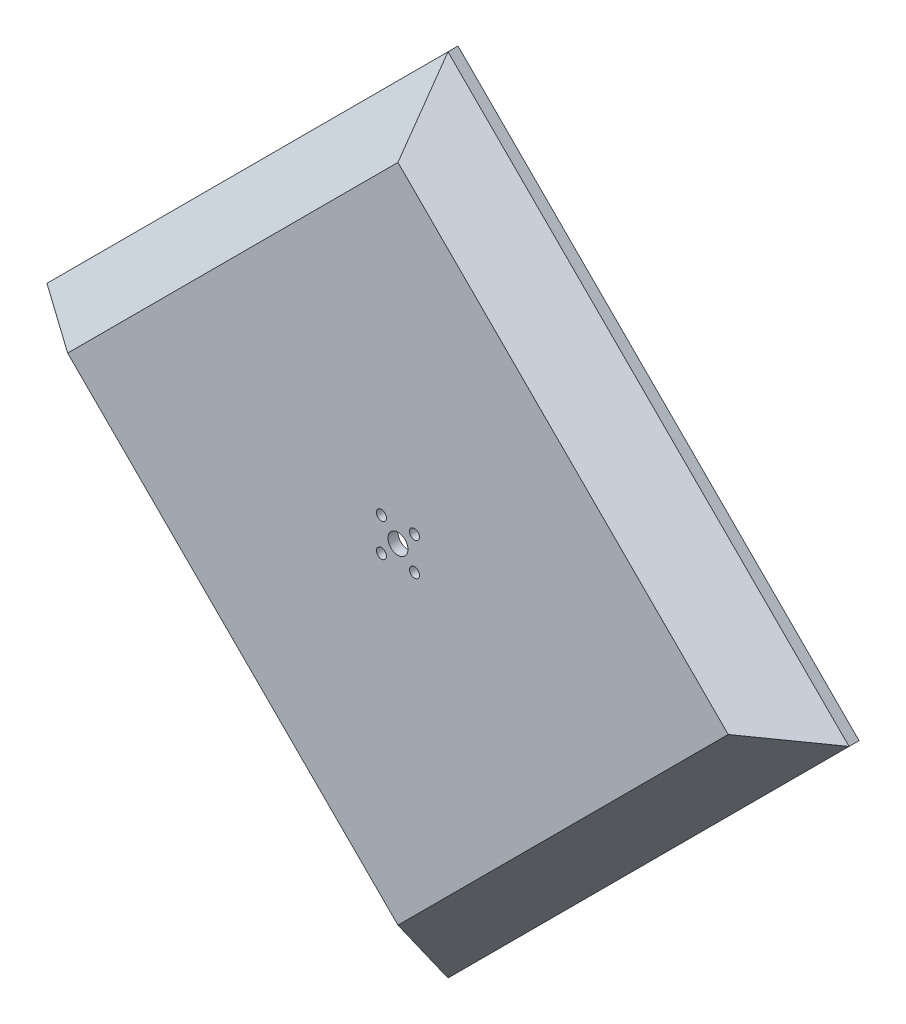
ISO-10303-21;
HEADER;
FILE_DESCRIPTION(('STEP AP214'),'2;1');
FILE_NAME('part.step','',(''),(''),'','','');
FILE_SCHEMA(('AUTOMOTIVE_DESIGN { 1 0 10303 214 1 1 1 1 }'));
ENDSEC;
DATA;
#1=APPLICATION_CONTEXT('core data for automotive mechanical design processes');
#2=APPLICATION_PROTOCOL_DEFINITION('international standard','automotive_design',2000,#1);
#3=PRODUCT_CONTEXT('',#1,'mechanical');
#4=PRODUCT('Part','Part','',(#3));
#5=PRODUCT_RELATED_PRODUCT_CATEGORY('part','',(#4));
#6=PRODUCT_DEFINITION_FORMATION('','',#4);
#7=PRODUCT_DEFINITION_CONTEXT('part definition',#1,'design');
#8=PRODUCT_DEFINITION('design','',#6,#7);
#9=PRODUCT_DEFINITION_SHAPE('','',#8);
#10=(LENGTH_UNIT() NAMED_UNIT(*) SI_UNIT(.MILLI.,.METRE.));
#11=(NAMED_UNIT(*) PLANE_ANGLE_UNIT() SI_UNIT($,.RADIAN.));
#12=(NAMED_UNIT(*) SI_UNIT($,.STERADIAN.) SOLID_ANGLE_UNIT());
#13=UNCERTAINTY_MEASURE_WITH_UNIT(LENGTH_MEASURE(1.E-05),#10,'distance_accuracy_value','');
#14=(GEOMETRIC_REPRESENTATION_CONTEXT(3) GLOBAL_UNCERTAINTY_ASSIGNED_CONTEXT((#13)) GLOBAL_UNIT_ASSIGNED_CONTEXT((#10,
#11,#12)) REPRESENTATION_CONTEXT('',''));
#15=CARTESIAN_POINT('',(0.,0.,0.));
#16=DIRECTION('',(0.,0.,1.));
#17=DIRECTION('',(1.,0.,0.));
#18=AXIS2_PLACEMENT_3D('',#15,#16,#17);
#19=CARTESIAN_POINT('',(0.,0.,0.));
#20=DIRECTION('',(0.,0.,1.));
#21=DIRECTION('',(1.,0.,0.));
#22=AXIS2_PLACEMENT_3D('',#19,#20,#21);
#23=PLANE('',#22);
#24=CARTESIAN_POINT('',(-4.95,-4.95,0.));
#25=DIRECTION('',(0.,0.,-1.));
#26=DIRECTION('',(-1.,0.,0.));
#27=AXIS2_PLACEMENT_3D('',#24,#25,#26);
#28=CIRCLE('',#27,1.5);
#29=CARTESIAN_POINT('',(-6.45,-4.95,0.));
#30=VERTEX_POINT('',#29);
#31=EDGE_CURVE('E229',#30,#30,#28,.T.);
#32=ORIENTED_EDGE('',*,*,#31,.F.);
#33=EDGE_LOOP('',(#32));
#34=FACE_BOUND('',#33,.T.);
#35=CARTESIAN_POINT('',(4.95,-4.95,0.));
#36=DIRECTION('',(0.,0.,-1.));
#37=DIRECTION('',(-1.,0.,0.));
#38=AXIS2_PLACEMENT_3D('',#35,#36,#37);
#39=CIRCLE('',#38,1.5);
#40=CARTESIAN_POINT('',(3.45,-4.95,0.));
#41=VERTEX_POINT('',#40);
#42=EDGE_CURVE('E221',#41,#41,#39,.T.);
#43=ORIENTED_EDGE('',*,*,#42,.F.);
#44=EDGE_LOOP('',(#43));
#45=FACE_BOUND('',#44,.T.);
#46=CARTESIAN_POINT('',(4.95,4.95,0.));
#47=DIRECTION('',(0.,0.,-1.));
#48=DIRECTION('',(-1.,0.,0.));
#49=AXIS2_PLACEMENT_3D('',#46,#47,#48);
#50=CIRCLE('',#49,1.5);
#51=CARTESIAN_POINT('',(3.45,4.95,0.));
#52=VERTEX_POINT('',#51);
#53=EDGE_CURVE('E213',#52,#52,#50,.T.);
#54=ORIENTED_EDGE('',*,*,#53,.F.);
#55=EDGE_LOOP('',(#54));
#56=FACE_BOUND('',#55,.T.);
#57=CARTESIAN_POINT('',(-4.95,4.95,0.));
#58=DIRECTION('',(0.,0.,-1.));
#59=DIRECTION('',(-1.,0.,0.));
#60=AXIS2_PLACEMENT_3D('',#57,#58,#59);
#61=CIRCLE('',#60,1.5);
#62=CARTESIAN_POINT('',(-6.45,4.95,0.));
#63=VERTEX_POINT('',#62);
#64=EDGE_CURVE('E204',#63,#63,#61,.T.);
#65=ORIENTED_EDGE('',*,*,#64,.F.);
#66=EDGE_LOOP('',(#65));
#67=FACE_BOUND('',#66,.T.);
#68=CARTESIAN_POINT('',(0.,0.,0.));
#69=DIRECTION('',(0.,0.,-1.));
#70=DIRECTION('',(-1.,0.,0.));
#71=AXIS2_PLACEMENT_3D('',#68,#69,#70);
#72=CIRCLE('',#71,3.);
#73=CARTESIAN_POINT('',(-3.,0.,0.));
#74=VERTEX_POINT('',#73);
#75=EDGE_CURVE('E208',#74,#74,#72,.T.);
#76=ORIENTED_EDGE('',*,*,#75,.F.);
#77=EDGE_LOOP('',(#76));
#78=FACE_BOUND('',#77,.T.);
#79=DIRECTION('',(-0.707106781186544,0.707106781186551,0.));
#80=VECTOR('',#79,1.);
#81=CARTESIAN_POINT('',(109.601551083914,-10.6066017177989,0.));
#82=LINE('',#81,#80);
#83=CARTESIAN_POINT('',(98.9949493661164,-6.956241138667E-13,0.));
#84=VERTEX_POINT('',#83);
#85=CARTESIAN_POINT('',(1.06858966120171E-12,98.9949493661157,0.));
#86=VERTEX_POINT('',#85);
#87=EDGE_CURVE('E193',#84,#86,#82,.T.);
#88=ORIENTED_EDGE('',*,*,#87,.F.);
#89=DIRECTION('',(0.707106781186554,0.707106781186541,0.));
#90=VECTOR('',#89,1.);
#91=CARTESIAN_POINT('',(-10.6066017177993,-109.601551083914,0.));
#92=LINE('',#91,#90);
#93=CARTESIAN_POINT('',(-3.81639164714898E-13,-98.9949493661164,0.));
#94=VERTEX_POINT('',#93);
#95=EDGE_CURVE('E60',#94,#84,#92,.T.);
#96=ORIENTED_EDGE('',*,*,#95,.F.);
#97=DIRECTION('',(0.707106781186544,-0.707106781186551,0.));
#98=VECTOR('',#97,1.);
#99=CARTESIAN_POINT('',(-109.601551083914,10.6066017177989,0.));
#100=LINE('',#99,#98);
#101=CARTESIAN_POINT('',(-98.9949493661167,1.06858966120171E-12,0.));
#102=VERTEX_POINT('',#101);
#103=EDGE_CURVE('E65',#102,#94,#100,.T.);
#104=ORIENTED_EDGE('',*,*,#103,.F.);
#105=DIRECTION('',(-0.707106781186559,-0.707106781186536,0.));
#106=VECTOR('',#105,1.);
#107=CARTESIAN_POINT('',(10.6066017178001,109.601551083914,0.));
#108=LINE('',#107,#106);
#109=EDGE_CURVE('E154',#86,#102,#108,.T.);
#110=ORIENTED_EDGE('',*,*,#109,.F.);
#111=EDGE_LOOP('',(#88,#96,#104,#110));
#112=FACE_BOUND('',#111,.T.);
#113=ADVANCED_FACE('F45',(#34,#45,#56,#67,#78,#112),#23,.F.);
#114=CARTESIAN_POINT('',(84.8528137423853,-35.3553390593278,34.9999999999998));
#115=DIRECTION('',(-0.500000000000003,-0.499999999999997,-0.707106781186547));
#116=DIRECTION('',(-0.816496580927724,0.,0.577350269189628));
#117=AXIS2_PLACEMENT_3D('',#114,#115,#116);
#118=PLANE('',#117);
#119=DIRECTION('',(0.816496580927726,0.,-0.577350269189625));
#120=VECTOR('',#119,1.);
#121=CARTESIAN_POINT('',(73.0677007226098,-5.27355936696949E-13,18.3333333333332));
#122=LINE('',#121,#120);
#123=CARTESIAN_POINT('',(120.208152801713,-7.7715611723761E-13,-15.));
#124=VERTEX_POINT('',#123);
#125=EDGE_CURVE('E181',#84,#124,#122,.T.);
#126=ORIENTED_EDGE('',*,*,#125,.F.);
#127=ORIENTED_EDGE('',*,*,#87,.T.);
#128=DIRECTION('',(0.,-0.816496580927725,0.577350269189628));
#129=VECTOR('',#128,1.);
#130=CARTESIAN_POINT('',(0.,-7.07106781186514,74.9999999999995));
#131=LINE('',#130,#129);
#132=CARTESIAN_POINT('',(3.87989273946798E-13,120.208152801713,-15.));
#133=VERTEX_POINT('',#132);
#134=EDGE_CURVE('E170',#133,#86,#131,.T.);
#135=ORIENTED_EDGE('',*,*,#134,.F.);
#136=DIRECTION('',(-0.707106781186544,0.707106781186551,0.));
#137=VECTOR('',#136,1.);
#138=CARTESIAN_POINT('',(120.208152801713,-7.7715611723761E-13,-15.));
#139=LINE('',#138,#137);
#140=EDGE_CURVE('E198',#124,#133,#139,.T.);
#141=ORIENTED_EDGE('',*,*,#140,.F.);
#142=EDGE_LOOP('',(#126,#127,#135,#141));
#143=FACE_BOUND('',#142,.T.);
#144=ADVANCED_FACE('F245',(#143),#118,.T.);
#145=CARTESIAN_POINT('',(85.9134739141651,-34.2946788875481,36.4999999999998));
#146=DIRECTION('',(0.500000000000002,0.499999999999997,0.707106781186548));
#147=DIRECTION('',(0.816496580927725,0.,-0.577350269189628));
#148=AXIS2_PLACEMENT_3D('',#145,#146,#147);
#149=PLANE('',#148);
#150=DIRECTION('',(-0.707106781186544,0.707106781186551,0.));
#151=VECTOR('',#150,1.);
#152=CARTESIAN_POINT('',(120.208152801713,-7.7715611723761E-13,-12.));
#153=LINE('',#152,#151);
#154=CARTESIAN_POINT('',(120.208152801712,-1.72421657621854E-12,-12.));
#155=VERTEX_POINT('',#154);
#156=CARTESIAN_POINT('',(3.78213664091006E-13,120.208152801711,-12.));
#157=VERTEX_POINT('',#156);
#158=EDGE_CURVE('E190',#155,#157,#153,.T.);
#159=ORIENTED_EDGE('',*,*,#158,.T.);
#160=DIRECTION('',(0.,-0.816496580927715,0.577350269189642));
#161=VECTOR('',#160,1.);
#162=CARTESIAN_POINT('',(1.56819002228303E-12,74.4819142849816,20.3333333333342));
#163=LINE('',#162,#161);
#164=CARTESIAN_POINT('',(9.21841306992609E-13,98.9949493661155,3.));
#165=VERTEX_POINT('',#164);
#166=EDGE_CURVE('E11',#157,#165,#163,.T.);
#167=ORIENTED_EDGE('',*,*,#166,.T.);
#168=DIRECTION('',(0.707106781186544,-0.707106781186551,0.));
#169=VECTOR('',#168,1.);
#170=CARTESIAN_POINT('',(-16.9705627484769,115.965512114594,3.));
#171=LINE('',#170,#169);
#172=CARTESIAN_POINT('',(98.9949493661158,-2.96688599613991E-13,3.));
#173=VERTEX_POINT('',#172);
#174=EDGE_CURVE('E135',#165,#173,#171,.T.);
#175=ORIENTED_EDGE('',*,*,#174,.T.);
#176=DIRECTION('',(0.816496580927706,0.,-0.577350269189654));
#177=VECTOR('',#176,1.);
#178=CARTESIAN_POINT('',(35.8267435801212,-1.11022302462516E-13,47.6666666666674));
#179=LINE('',#178,#177);
#180=EDGE_CURVE('E264',#173,#155,#179,.T.);
#181=ORIENTED_EDGE('',*,*,#180,.T.);
#182=EDGE_LOOP('',(#159,#167,#175,#181));
#183=FACE_BOUND('',#182,.T.);
#184=ADVANCED_FACE('F286',(#183),#149,.T.);
#185=CARTESIAN_POINT('',(0.,0.,3.));
#186=DIRECTION('',(0.,0.,1.));
#187=DIRECTION('',(1.,0.,0.));
#188=AXIS2_PLACEMENT_3D('',#185,#186,#187);
#189=PLANE('',#188);
#190=ORIENTED_EDGE('',*,*,#174,.F.);
#191=DIRECTION('',(0.707106781186548,0.707106781186546,0.));
#192=VECTOR('',#191,1.);
#193=CARTESIAN_POINT('',(-115.965512114593,-16.9705627484773,3.));
#194=LINE('',#193,#192);
#195=CARTESIAN_POINT('',(-98.9949493661163,1.45633505255194E-12,3.00000000000001));
#196=VERTEX_POINT('',#195);
#197=EDGE_CURVE('E134',#196,#165,#194,.T.);
#198=ORIENTED_EDGE('',*,*,#197,.F.);
#199=DIRECTION('',(-0.707106781186539,0.707106781186556,0.));
#200=VECTOR('',#199,1.);
#201=CARTESIAN_POINT('',(16.9705627484761,-115.965512114594,3.));
#202=LINE('',#201,#200);
#203=CARTESIAN_POINT('',(-6.34029865646341E-13,-98.9949493661165,3.00000000000001));
#204=VERTEX_POINT('',#203);
#205=EDGE_CURVE('E129',#204,#196,#202,.T.);
#206=ORIENTED_EDGE('',*,*,#205,.F.);
#207=DIRECTION('',(-0.707106781186548,-0.707106781186546,0.));
#208=VECTOR('',#207,1.);
#209=CARTESIAN_POINT('',(115.965512114593,16.9705627484773,3.));
#210=LINE('',#209,#208);
#211=EDGE_CURVE('E267',#173,#204,#210,.T.);
#212=ORIENTED_EDGE('',*,*,#211,.F.);
#213=EDGE_LOOP('',(#190,#198,#206,#212));
#214=FACE_BOUND('',#213,.T.);
#215=CARTESIAN_POINT('',(-4.95,-4.95,3.));
#216=DIRECTION('',(0.,0.,-1.));
#217=DIRECTION('',(-1.,0.,0.));
#218=AXIS2_PLACEMENT_3D('',#215,#216,#217);
#219=CIRCLE('',#218,1.5);
#220=CARTESIAN_POINT('',(-6.45,-4.95,3.));
#221=VERTEX_POINT('',#220);
#222=EDGE_CURVE('E197',#221,#221,#219,.T.);
#223=ORIENTED_EDGE('',*,*,#222,.T.);
#224=EDGE_LOOP('',(#223));
#225=FACE_BOUND('',#224,.T.);
#226=CARTESIAN_POINT('',(4.95,-4.95,3.));
#227=DIRECTION('',(0.,0.,-1.));
#228=DIRECTION('',(-1.,0.,0.));
#229=AXIS2_PLACEMENT_3D('',#226,#227,#228);
#230=CIRCLE('',#229,1.5);
#231=CARTESIAN_POINT('',(3.45,-4.95,3.));
#232=VERTEX_POINT('',#231);
#233=EDGE_CURVE('E225',#232,#232,#230,.T.);
#234=ORIENTED_EDGE('',*,*,#233,.T.);
#235=EDGE_LOOP('',(#234));
#236=FACE_BOUND('',#235,.T.);
#237=CARTESIAN_POINT('',(4.95,4.95,3.));
#238=DIRECTION('',(0.,0.,-1.));
#239=DIRECTION('',(-1.,0.,0.));
#240=AXIS2_PLACEMENT_3D('',#237,#238,#239);
#241=CIRCLE('',#240,1.5);
#242=CARTESIAN_POINT('',(3.45,4.95,3.));
#243=VERTEX_POINT('',#242);
#244=EDGE_CURVE('E217',#243,#243,#241,.T.);
#245=ORIENTED_EDGE('',*,*,#244,.T.);
#246=EDGE_LOOP('',(#245));
#247=FACE_BOUND('',#246,.T.);
#248=CARTESIAN_POINT('',(-4.95,4.95,3.));
#249=DIRECTION('',(0.,0.,-1.));
#250=DIRECTION('',(-1.,0.,0.));
#251=AXIS2_PLACEMENT_3D('',#248,#249,#250);
#252=CIRCLE('',#251,1.5);
#253=CARTESIAN_POINT('',(-6.45,4.95,3.));
#254=VERTEX_POINT('',#253);
#255=EDGE_CURVE('E209',#254,#254,#252,.T.);
#256=ORIENTED_EDGE('',*,*,#255,.T.);
#257=EDGE_LOOP('',(#256));
#258=FACE_BOUND('',#257,.T.);
#259=CARTESIAN_POINT('',(0.,0.,3.));
#260=DIRECTION('',(0.,0.,-1.));
#261=DIRECTION('',(-1.,0.,0.));
#262=AXIS2_PLACEMENT_3D('',#259,#260,#261);
#263=CIRCLE('',#262,3.);
#264=CARTESIAN_POINT('',(-3.,0.,3.));
#265=VERTEX_POINT('',#264);
#266=EDGE_CURVE('E53',#265,#265,#263,.T.);
#267=ORIENTED_EDGE('',*,*,#266,.T.);
#268=EDGE_LOOP('',(#267));
#269=FACE_BOUND('',#268,.T.);
#270=ADVANCED_FACE('F289',(#214,#225,#236,#247,#258,#269),#189,.T.);
#271=CARTESIAN_POINT('',(0.,0.,3.));
#272=DIRECTION('',(0.,0.,-1.));
#273=DIRECTION('',(-1.,0.,0.));
#274=AXIS2_PLACEMENT_3D('',#271,#272,#273);
#275=CYLINDRICAL_SURFACE('',#274,3.);
#276=ORIENTED_EDGE('',*,*,#266,.F.);
#277=EDGE_LOOP('',(#276));
#278=FACE_BOUND('',#277,.T.);
#279=ORIENTED_EDGE('',*,*,#75,.T.);
#280=EDGE_LOOP('',(#279));
#281=FACE_BOUND('',#280,.T.);
#282=ADVANCED_FACE('F242',(#278,#281),#275,.F.);
#283=CARTESIAN_POINT('',(-4.95,4.95,3.));
#284=DIRECTION('',(0.,0.,-1.));
#285=DIRECTION('',(-1.,0.,0.));
#286=AXIS2_PLACEMENT_3D('',#283,#284,#285);
#287=CYLINDRICAL_SURFACE('',#286,1.5);
#288=ORIENTED_EDGE('',*,*,#255,.F.);
#289=EDGE_LOOP('',(#288));
#290=FACE_BOUND('',#289,.T.);
#291=ORIENTED_EDGE('',*,*,#64,.T.);
#292=EDGE_LOOP('',(#291));
#293=FACE_BOUND('',#292,.T.);
#294=ADVANCED_FACE('F303',(#290,#293),#287,.F.);
#295=CARTESIAN_POINT('',(4.95,4.95,3.));
#296=DIRECTION('',(0.,0.,-1.));
#297=DIRECTION('',(-1.,0.,0.));
#298=AXIS2_PLACEMENT_3D('',#295,#296,#297);
#299=CYLINDRICAL_SURFACE('',#298,1.5);
#300=ORIENTED_EDGE('',*,*,#244,.F.);
#301=EDGE_LOOP('',(#300));
#302=FACE_BOUND('',#301,.T.);
#303=ORIENTED_EDGE('',*,*,#53,.T.);
#304=EDGE_LOOP('',(#303));
#305=FACE_BOUND('',#304,.T.);
#306=ADVANCED_FACE('F309',(#302,#305),#299,.F.);
#307=CARTESIAN_POINT('',(4.95,-4.95,3.));
#308=DIRECTION('',(0.,0.,-1.));
#309=DIRECTION('',(-1.,0.,0.));
#310=AXIS2_PLACEMENT_3D('',#307,#308,#309);
#311=CYLINDRICAL_SURFACE('',#310,1.5);
#312=ORIENTED_EDGE('',*,*,#233,.F.);
#313=EDGE_LOOP('',(#312));
#314=FACE_BOUND('',#313,.T.);
#315=ORIENTED_EDGE('',*,*,#42,.T.);
#316=EDGE_LOOP('',(#315));
#317=FACE_BOUND('',#316,.T.);
#318=ADVANCED_FACE('F316',(#314,#317),#311,.F.);
#319=CARTESIAN_POINT('',(-4.95,-4.95,3.));
#320=DIRECTION('',(0.,0.,-1.));
#321=DIRECTION('',(-1.,0.,0.));
#322=AXIS2_PLACEMENT_3D('',#319,#320,#321);
#323=CYLINDRICAL_SURFACE('',#322,1.5);
#324=ORIENTED_EDGE('',*,*,#222,.F.);
#325=EDGE_LOOP('',(#324));
#326=FACE_BOUND('',#325,.T.);
#327=ORIENTED_EDGE('',*,*,#31,.T.);
#328=EDGE_LOOP('',(#327));
#329=FACE_BOUND('',#328,.T.);
#330=ADVANCED_FACE('F313',(#326,#329),#323,.F.);
#331=CARTESIAN_POINT('',(-60.1040764008567,-60.1040764008565,10.));
#332=DIRECTION('',(-0.707106781186549,-0.707106781186546,0.));
#333=DIRECTION('',(0.707106781186546,-0.707106781186549,0.));
#334=AXIS2_PLACEMENT_3D('',#331,#332,#333);
#335=PLANE('',#334);
#336=DIRECTION('',(0.707106781186544,-0.707106781186551,0.));
#337=VECTOR('',#336,1.);
#338=CARTESIAN_POINT('',(-120.208152801713,7.7715611723761E-13,-12.));
#339=LINE('',#338,#337);
#340=CARTESIAN_POINT('',(-120.208152801712,2.5636256207865E-12,-12.));
#341=VERTEX_POINT('',#340);
#342=CARTESIAN_POINT('',(-1.30451205393456E-12,-120.208152801712,-12.));
#343=VERTEX_POINT('',#342);
#344=EDGE_CURVE('E110',#341,#343,#339,.T.);
#345=ORIENTED_EDGE('',*,*,#344,.F.);
#346=DIRECTION('',(0.,0.,-1.));
#347=VECTOR('',#346,1.);
#348=CARTESIAN_POINT('',(-120.208152801713,7.7715611723761E-13,0.));
#349=LINE('',#348,#347);
#350=CARTESIAN_POINT('',(-120.208152801713,7.7715611723761E-13,-15.));
#351=VERTEX_POINT('',#350);
#352=EDGE_CURVE('E115',#341,#351,#349,.T.);
#353=ORIENTED_EDGE('',*,*,#352,.T.);
#354=DIRECTION('',(0.707106781186544,-0.707106781186551,0.));
#355=VECTOR('',#354,1.);
#356=CARTESIAN_POINT('',(-120.208152801713,7.7715611723761E-13,-15.));
#357=LINE('',#356,#355);
#358=CARTESIAN_POINT('',(-1.19348975147204E-12,-120.208152801713,-15.));
#359=VERTEX_POINT('',#358);
#360=EDGE_CURVE('E122',#351,#359,#357,.T.);
#361=ORIENTED_EDGE('',*,*,#360,.T.);
#362=DIRECTION('',(0.,0.,-1.));
#363=VECTOR('',#362,1.);
#364=CARTESIAN_POINT('',(-1.19348975147204E-12,-120.208152801713,0.));
#365=LINE('',#364,#363);
#366=EDGE_CURVE('E118',#343,#359,#365,.T.);
#367=ORIENTED_EDGE('',*,*,#366,.F.);
#368=EDGE_LOOP('',(#345,#353,#361,#367));
#369=FACE_BOUND('',#368,.T.);
#370=ADVANCED_FACE('F112',(#369),#335,.T.);
#371=CARTESIAN_POINT('',(60.1040764008567,60.1040764008565,10.));
#372=DIRECTION('',(-0.707106781186549,-0.707106781186546,0.));
#373=DIRECTION('',(0.707106781186546,-0.707106781186549,0.));
#374=AXIS2_PLACEMENT_3D('',#371,#372,#373);
#375=PLANE('',#374);
#376=DIRECTION('',(0.,0.,-1.));
#377=VECTOR('',#376,1.);
#378=CARTESIAN_POINT('',(3.88578058618805E-13,120.208152801713,0.));
#379=LINE('',#378,#377);
#380=EDGE_CURVE('E185',#157,#133,#379,.T.);
#381=ORIENTED_EDGE('',*,*,#380,.F.);
#382=ORIENTED_EDGE('',*,*,#158,.F.);
#383=DIRECTION('',(0.,0.,-1.));
#384=VECTOR('',#383,1.);
#385=CARTESIAN_POINT('',(120.208152801713,-7.7715611723761E-13,0.));
#386=LINE('',#385,#384);
#387=EDGE_CURVE('E186',#155,#124,#386,.T.);
#388=ORIENTED_EDGE('',*,*,#387,.T.);
#389=ORIENTED_EDGE('',*,*,#140,.T.);
#390=EDGE_LOOP('',(#381,#382,#388,#389));
#391=FACE_BOUND('',#390,.T.);
#392=ADVANCED_FACE('F284',(#391),#375,.F.);
#393=CARTESIAN_POINT('',(-60.1040764008562,60.1040764008569,3.));
#394=DIRECTION('',(-0.707106781186544,0.707106781186551,0.));
#395=DIRECTION('',(-0.707106781186551,-0.707106781186544,0.));
#396=AXIS2_PLACEMENT_3D('',#393,#394,#395);
#397=PLANE('',#396);
#398=DIRECTION('',(-0.707106781186559,-0.707106781186536,0.));
#399=VECTOR('',#398,1.);
#400=CARTESIAN_POINT('',(2.05391259555654E-12,120.208152801713,-12.));
#401=LINE('',#400,#399);
#402=EDGE_CURVE('E139',#157,#341,#401,.T.);
#403=ORIENTED_EDGE('',*,*,#402,.F.);
#404=ORIENTED_EDGE('',*,*,#380,.T.);
#405=DIRECTION('',(-0.707106781186559,-0.707106781186536,0.));
#406=VECTOR('',#405,1.);
#407=CARTESIAN_POINT('',(2.05391259555654E-12,120.208152801713,-15.));
#408=LINE('',#407,#406);
#409=EDGE_CURVE('E145',#133,#351,#408,.T.);
#410=ORIENTED_EDGE('',*,*,#409,.T.);
#411=ORIENTED_EDGE('',*,*,#352,.F.);
#412=EDGE_LOOP('',(#403,#404,#410,#411));
#413=FACE_BOUND('',#412,.T.);
#414=ADVANCED_FACE('F148',(#413),#397,.T.);
#415=CARTESIAN_POINT('',(60.1040764008572,-60.1040764008559,3.));
#416=DIRECTION('',(0.707106781186555,-0.70710678118654,0.));
#417=DIRECTION('',(0.70710678118654,0.707106781186555,0.));
#418=AXIS2_PLACEMENT_3D('',#415,#416,#417);
#419=PLANE('',#418);
#420=DIRECTION('',(0.707106781186554,0.707106781186541,0.));
#421=VECTOR('',#420,1.);
#422=CARTESIAN_POINT('',(-1.19348975147204E-12,-120.208152801713,-12.));
#423=LINE('',#422,#421);
#424=EDGE_CURVE('E167',#343,#155,#423,.T.);
#425=ORIENTED_EDGE('',*,*,#424,.F.);
#426=ORIENTED_EDGE('',*,*,#366,.T.);
#427=DIRECTION('',(0.707106781186554,0.707106781186541,0.));
#428=VECTOR('',#427,1.);
#429=CARTESIAN_POINT('',(-1.19348975147204E-12,-120.208152801713,-15.));
#430=LINE('',#429,#428);
#431=EDGE_CURVE('E171',#359,#124,#430,.T.);
#432=ORIENTED_EDGE('',*,*,#431,.T.);
#433=ORIENTED_EDGE('',*,*,#387,.F.);
#434=EDGE_LOOP('',(#425,#426,#432,#433));
#435=FACE_BOUND('',#434,.T.);
#436=ADVANCED_FACE('F281',(#435),#419,.T.);
#437=CARTESIAN_POINT('',(-35.3553390593281,-84.8528137423852,34.9999999999998));
#438=DIRECTION('',(-0.499999999999996,0.500000000000004,-0.707106781186547));
#439=DIRECTION('',(0.,0.816496580927724,0.577350269189629));
#440=AXIS2_PLACEMENT_3D('',#437,#438,#439);
#441=PLANE('',#440);
#442=ORIENTED_EDGE('',*,*,#95,.T.);
#443=ORIENTED_EDGE('',*,*,#125,.T.);
#444=ORIENTED_EDGE('',*,*,#431,.F.);
#445=DIRECTION('',(0.,-0.816496580927725,-0.577350269189627));
#446=VECTOR('',#445,1.);
#447=CARTESIAN_POINT('',(-5.06539254985228E-13,-73.0677007226096,18.3333333333331));
#448=LINE('',#447,#446);
#449=EDGE_CURVE('E159',#94,#359,#448,.T.);
#450=ORIENTED_EDGE('',*,*,#449,.F.);
#451=EDGE_LOOP('',(#442,#443,#444,#450));
#452=FACE_BOUND('',#451,.T.);
#453=ADVANCED_FACE('F249',(#452),#441,.T.);
#454=CARTESIAN_POINT('',(-34.2946788875484,-85.913473914165,36.4999999999998));
#455=DIRECTION('',(0.499999999999995,-0.500000000000004,0.707106781186548));
#456=DIRECTION('',(0.,-0.816496580927724,-0.577350269189629));
#457=AXIS2_PLACEMENT_3D('',#454,#455,#456);
#458=PLANE('',#457);
#459=ORIENTED_EDGE('',*,*,#424,.T.);
#460=ORIENTED_EDGE('',*,*,#180,.F.);
#461=ORIENTED_EDGE('',*,*,#211,.T.);
#462=DIRECTION('',(0.,-0.816496580927708,-0.577350269189652));
#463=VECTOR('',#462,1.);
#464=CARTESIAN_POINT('',(-2.22044604925031E-13,-35.8267435801205,47.6666666666681));
#465=LINE('',#464,#463);
#466=EDGE_CURVE('E270',#204,#343,#465,.T.);
#467=ORIENTED_EDGE('',*,*,#466,.T.);
#468=EDGE_LOOP('',(#459,#460,#461,#467));
#469=FACE_BOUND('',#468,.T.);
#470=ADVANCED_FACE('F276',(#469),#458,.T.);
#471=CARTESIAN_POINT('',(35.3553390593287,84.8528137423849,34.9999999999998));
#472=DIRECTION('',(0.499999999999992,-0.500000000000008,-0.707106781186547));
#473=DIRECTION('',(0.,0.816496580927722,-0.577350269189632));
#474=AXIS2_PLACEMENT_3D('',#471,#472,#473);
#475=PLANE('',#474);
#476=ORIENTED_EDGE('',*,*,#409,.F.);
#477=ORIENTED_EDGE('',*,*,#134,.T.);
#478=ORIENTED_EDGE('',*,*,#109,.T.);
#479=DIRECTION('',(-0.816496580927727,0.,-0.577350269189624));
#480=VECTOR('',#479,1.);
#481=CARTESIAN_POINT('',(-73.06770072261,7.7715611723761E-13,18.3333333333332));
#482=LINE('',#481,#480);
#483=EDGE_CURVE('E151',#102,#351,#482,.T.);
#484=ORIENTED_EDGE('',*,*,#483,.T.);
#485=EDGE_LOOP('',(#476,#477,#478,#484));
#486=FACE_BOUND('',#485,.T.);
#487=ADVANCED_FACE('F254',(#486),#475,.T.);
#488=CARTESIAN_POINT('',(34.294678887549,85.9134739141648,36.4999999999998));
#489=DIRECTION('',(-0.499999999999992,0.500000000000008,0.707106781186548));
#490=DIRECTION('',(0.,-0.816496580927722,0.577350269189632));
#491=AXIS2_PLACEMENT_3D('',#488,#489,#490);
#492=PLANE('',#491);
#493=ORIENTED_EDGE('',*,*,#166,.F.);
#494=ORIENTED_EDGE('',*,*,#402,.T.);
#495=DIRECTION('',(-0.816496580927717,0.,-0.577350269189639));
#496=VECTOR('',#495,1.);
#497=CARTESIAN_POINT('',(5.65685424948866,-3.80251385934116E-12,76.9999999999996));
#498=LINE('',#497,#496);
#499=EDGE_CURVE('E125',#196,#341,#498,.T.);
#500=ORIENTED_EDGE('',*,*,#499,.F.);
#501=ORIENTED_EDGE('',*,*,#197,.T.);
#502=EDGE_LOOP('',(#493,#494,#500,#501));
#503=FACE_BOUND('',#502,.T.);
#504=ADVANCED_FACE('F140',(#503),#492,.T.);
#505=CARTESIAN_POINT('',(-84.8528137423853,35.3553390593278,34.9999999999998));
#506=DIRECTION('',(0.500000000000003,0.499999999999997,-0.707106781186547));
#507=DIRECTION('',(-0.816496580927724,0.,-0.577350269189628));
#508=AXIS2_PLACEMENT_3D('',#505,#506,#507);
#509=PLANE('',#508);
#510=ORIENTED_EDGE('',*,*,#103,.T.);
#511=ORIENTED_EDGE('',*,*,#449,.T.);
#512=ORIENTED_EDGE('',*,*,#360,.F.);
#513=ORIENTED_EDGE('',*,*,#483,.F.);
#514=EDGE_LOOP('',(#510,#511,#512,#513));
#515=FACE_BOUND('',#514,.T.);
#516=ADVANCED_FACE('F252',(#515),#509,.T.);
#517=CARTESIAN_POINT('',(-85.9134739141651,34.2946788875481,36.4999999999998));
#518=DIRECTION('',(-0.500000000000002,-0.499999999999997,0.707106781186548));
#519=DIRECTION('',(0.816496580927725,0.,0.577350269189628));
#520=AXIS2_PLACEMENT_3D('',#517,#518,#519);
#521=PLANE('',#520);
#522=ORIENTED_EDGE('',*,*,#344,.T.);
#523=ORIENTED_EDGE('',*,*,#466,.F.);
#524=ORIENTED_EDGE('',*,*,#205,.T.);
#525=ORIENTED_EDGE('',*,*,#499,.T.);
#526=EDGE_LOOP('',(#522,#523,#524,#525));
#527=FACE_BOUND('',#526,.T.);
#528=ADVANCED_FACE('F127',(#527),#521,.T.);
#529=CLOSED_SHELL('',(#113,#144,#184,#270,#282,#294,#306,#318,#330,#370,#392,#414,#436,#453,
#470,#487,#504,#516,#528));
#530=MANIFOLD_SOLID_BREP('B2',#529);
#531=ADVANCED_BREP_SHAPE_REPRESENTATION('',(#18,#530),#14);
#532=SHAPE_DEFINITION_REPRESENTATION(#9,#531);
ENDSEC;
END-ISO-10303-21;
